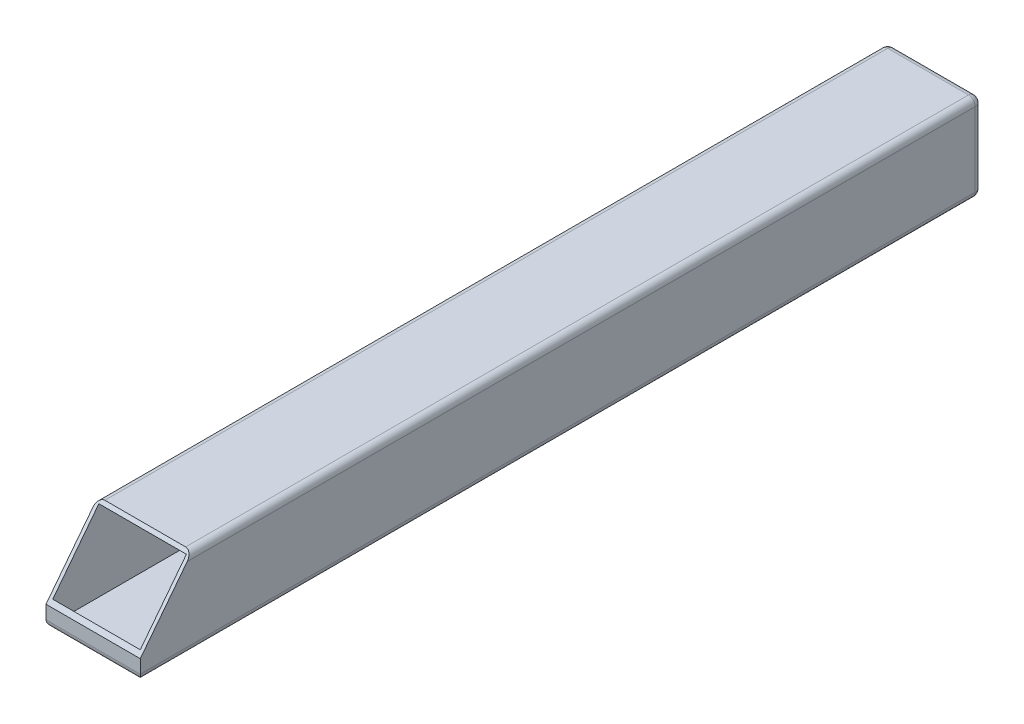
ISO-10303-21;
HEADER;
FILE_DESCRIPTION(('STEP AP214'),'2;1');
FILE_NAME('part.step','',(''),(''),'','','');
FILE_SCHEMA(('AUTOMOTIVE_DESIGN { 1 0 10303 214 1 1 1 1 }'));
ENDSEC;
DATA;
#1=APPLICATION_CONTEXT('core data for automotive mechanical design processes');
#2=APPLICATION_PROTOCOL_DEFINITION('international standard','automotive_design',2000,#1);
#3=PRODUCT_CONTEXT('',#1,'mechanical');
#4=PRODUCT('Part','Part','',(#3));
#5=PRODUCT_RELATED_PRODUCT_CATEGORY('part','',(#4));
#6=PRODUCT_DEFINITION_FORMATION('','',#4);
#7=PRODUCT_DEFINITION_CONTEXT('part definition',#1,'design');
#8=PRODUCT_DEFINITION('design','',#6,#7);
#9=PRODUCT_DEFINITION_SHAPE('','',#8);
#10=(LENGTH_UNIT() NAMED_UNIT(*) SI_UNIT(.MILLI.,.METRE.));
#11=(NAMED_UNIT(*) PLANE_ANGLE_UNIT() SI_UNIT($,.RADIAN.));
#12=(NAMED_UNIT(*) SI_UNIT($,.STERADIAN.) SOLID_ANGLE_UNIT());
#13=UNCERTAINTY_MEASURE_WITH_UNIT(LENGTH_MEASURE(1.E-05),#10,'distance_accuracy_value','');
#14=(GEOMETRIC_REPRESENTATION_CONTEXT(3) GLOBAL_UNCERTAINTY_ASSIGNED_CONTEXT((#13)) GLOBAL_UNIT_ASSIGNED_CONTEXT((#10,
#11,#12)) REPRESENTATION_CONTEXT('',''));
#15=CARTESIAN_POINT('',(0.,0.,0.));
#16=DIRECTION('',(0.,0.,1.));
#17=DIRECTION('',(1.,0.,0.));
#18=AXIS2_PLACEMENT_3D('',#15,#16,#17);
#19=CARTESIAN_POINT('',(-160.609485721589,165.1,-98.3178869980096));
#20=DIRECTION('',(0.,-0.612154920715207,-0.790737853554614));
#21=DIRECTION('',(0.,0.790737853554615,-0.612154920715207));
#22=AXIS2_PLACEMENT_3D('',#19,#20,#21);
#23=PLANE('',#22);
#24=DIRECTION('',(1.,0.,0.));
#25=VECTOR('',#24,1.);
#26=CARTESIAN_POINT('',(-160.609485721589,165.1,-98.3178869980096));
#27=LINE('',#26,#25);
#28=CARTESIAN_POINT('',(12.7,165.1,-98.3178869980096));
#29=VERTEX_POINT('',#28);
#30=CARTESIAN_POINT('',(165.1,165.1,-98.3178869980096));
#31=VERTEX_POINT('',#30);
#32=EDGE_CURVE('E222',#29,#31,#27,.T.);
#33=ORIENTED_EDGE('',*,*,#32,.F.);
#34=CARTESIAN_POINT('',(12.7,152.4,-88.4860982982086));
#35=DIRECTION('',(0.,-0.612154920715207,-0.790737853554614));
#36=DIRECTION('',(0.,-0.790737853554615,0.612154920715207));
#37=AXIS2_PLACEMENT_3D('',#34,#35,#36);
#38=ELLIPSE('',#37,16.0609485721589,12.7);
#39=CARTESIAN_POINT('',(0.,152.4,-88.4860982982087));
#40=VERTEX_POINT('',#39);
#41=EDGE_CURVE('E11',#29,#40,#38,.F.);
#42=ORIENTED_EDGE('',*,*,#41,.T.);
#43=DIRECTION('',(0.,-0.790737853554615,0.612154920715207));
#44=VECTOR('',#43,1.);
#45=CARTESIAN_POINT('',(0.,165.1,-98.3178869980096));
#46=LINE('',#45,#44);
#47=CARTESIAN_POINT('',(0.,38.1,0.));
#48=VERTEX_POINT('',#47);
#49=EDGE_CURVE('E226',#40,#48,#46,.T.);
#50=ORIENTED_EDGE('',*,*,#49,.T.);
#51=DIRECTION('',(1.,0.,0.));
#52=VECTOR('',#51,1.);
#53=CARTESIAN_POINT('',(-160.609485721589,38.1,0.));
#54=LINE('',#53,#52);
#55=CARTESIAN_POINT('',(177.8,38.1,0.));
#56=VERTEX_POINT('',#55);
#57=EDGE_CURVE('E221',#48,#56,#54,.T.);
#58=ORIENTED_EDGE('',*,*,#57,.T.);
#59=DIRECTION('',(0.,0.790737853554614,-0.612154920715207));
#60=VECTOR('',#59,1.);
#61=CARTESIAN_POINT('',(177.8,165.1,-98.3178869980096));
#62=LINE('',#61,#60);
#63=CARTESIAN_POINT('',(177.8,152.4,-88.4860982982087));
#64=VERTEX_POINT('',#63);
#65=EDGE_CURVE('E166',#56,#64,#62,.T.);
#66=ORIENTED_EDGE('',*,*,#65,.T.);
#67=CARTESIAN_POINT('',(165.1,152.4,-88.4860982982086));
#68=DIRECTION('',(0.,-0.612154920715207,-0.790737853554614));
#69=DIRECTION('',(0.,0.790737853554615,-0.612154920715207));
#70=AXIS2_PLACEMENT_3D('',#67,#68,#69);
#71=ELLIPSE('',#70,16.0609485721589,12.7);
#72=EDGE_CURVE('E49',#64,#31,#71,.F.);
#73=ORIENTED_EDGE('',*,*,#72,.T.);
#74=EDGE_LOOP('',(#33,#42,#50,#58,#66,#73));
#75=FACE_BOUND('',#74,.T.);
#76=DIRECTION('',(0.,-0.790737853554615,0.612154920715207));
#77=VECTOR('',#76,1.);
#78=CARTESIAN_POINT('',(6.34999999999999,165.1,-98.3178869980096));
#79=LINE('',#78,#77);
#80=CARTESIAN_POINT('',(6.35,158.75,-93.4019926481091));
#81=VERTEX_POINT('',#80);
#82=CARTESIAN_POINT('',(6.35,46.3024748967228,-6.35));
#83=VERTEX_POINT('',#82);
#84=EDGE_CURVE('E162',#81,#83,#79,.T.);
#85=ORIENTED_EDGE('',*,*,#84,.F.);
#86=DIRECTION('',(1.,0.,0.));
#87=VECTOR('',#86,1.);
#88=CARTESIAN_POINT('',(0.,158.75,-93.4019926481091));
#89=LINE('',#88,#87);
#90=CARTESIAN_POINT('',(171.45,158.75,-93.4019926481091));
#91=VERTEX_POINT('',#90);
#92=EDGE_CURVE('E185',#81,#91,#89,.T.);
#93=ORIENTED_EDGE('',*,*,#92,.T.);
#94=DIRECTION('',(0.,0.790737853554615,-0.612154920715207));
#95=VECTOR('',#94,1.);
#96=CARTESIAN_POINT('',(171.45,165.1,-98.3178869980096));
#97=LINE('',#96,#95);
#98=CARTESIAN_POINT('',(171.45,46.3024748967228,-6.35));
#99=VERTEX_POINT('',#98);
#100=EDGE_CURVE('E211',#99,#91,#97,.T.);
#101=ORIENTED_EDGE('',*,*,#100,.F.);
#102=DIRECTION('',(1.,0.,0.));
#103=VECTOR('',#102,1.);
#104=CARTESIAN_POINT('',(-160.609485721589,46.3024748967228,-6.34999999999999));
#105=LINE('',#104,#103);
#106=EDGE_CURVE('E208',#83,#99,#105,.T.);
#107=ORIENTED_EDGE('',*,*,#106,.F.);
#108=EDGE_LOOP('',(#85,#93,#101,#107));
#109=FACE_BOUND('',#108,.T.);
#110=ADVANCED_FACE('F39',(#75,#109),#23,.F.);
#111=CARTESIAN_POINT('',(0.,165.1,0.));
#112=DIRECTION('',(1.,0.,0.));
#113=DIRECTION('',(0.,0.,-1.));
#114=AXIS2_PLACEMENT_3D('',#111,#112,#113);
#115=PLANE('',#114);
#116=DIRECTION('',(0.,-1.,0.));
#117=VECTOR('',#116,1.);
#118=CARTESIAN_POINT('',(0.,165.1,-1574.8));
#119=LINE('',#118,#117);
#120=CARTESIAN_POINT('',(0.,152.4,-1574.8));
#121=VERTEX_POINT('',#120);
#122=CARTESIAN_POINT('',(0.,12.7,-1574.8));
#123=VERTEX_POINT('',#122);
#124=EDGE_CURVE('E57',#121,#123,#119,.T.);
#125=ORIENTED_EDGE('',*,*,#124,.T.);
#126=DIRECTION('',(0.,0.,1.));
#127=VECTOR('',#126,1.);
#128=CARTESIAN_POINT('',(0.,12.7,0.));
#129=LINE('',#128,#127);
#130=CARTESIAN_POINT('',(0.,12.7,0.));
#131=VERTEX_POINT('',#130);
#132=EDGE_CURVE('E288',#123,#131,#129,.T.);
#133=ORIENTED_EDGE('',*,*,#132,.T.);
#134=DIRECTION('',(0.,-1.,0.));
#135=VECTOR('',#134,1.);
#136=CARTESIAN_POINT('',(0.,165.1,0.));
#137=LINE('',#136,#135);
#138=EDGE_CURVE('E235',#48,#131,#137,.T.);
#139=ORIENTED_EDGE('',*,*,#138,.F.);
#140=ORIENTED_EDGE('',*,*,#49,.F.);
#141=DIRECTION('',(0.,0.,1.));
#142=VECTOR('',#141,1.);
#143=CARTESIAN_POINT('',(0.,152.4,0.));
#144=LINE('',#143,#142);
#145=EDGE_CURVE('E62',#40,#121,#144,.F.);
#146=ORIENTED_EDGE('',*,*,#145,.T.);
#147=EDGE_LOOP('',(#125,#133,#139,#140,#146));
#148=FACE_BOUND('',#147,.T.);
#149=ADVANCED_FACE('F417',(#148),#115,.F.);
#150=CARTESIAN_POINT('',(0.,165.1,0.));
#151=DIRECTION('',(0.,0.,-1.));
#152=DIRECTION('',(-1.,0.,0.));
#153=AXIS2_PLACEMENT_3D('',#150,#151,#152);
#154=PLANE('',#153);
#155=ORIENTED_EDGE('',*,*,#138,.T.);
#156=DIRECTION('',(1.,0.,0.));
#157=VECTOR('',#156,1.);
#158=CARTESIAN_POINT('',(177.8,12.7,0.));
#159=LINE('',#158,#157);
#160=CARTESIAN_POINT('',(177.8,12.7,0.));
#161=VERTEX_POINT('',#160);
#162=EDGE_CURVE('E291',#131,#161,#159,.T.);
#163=ORIENTED_EDGE('',*,*,#162,.T.);
#164=DIRECTION('',(0.,-1.,0.));
#165=VECTOR('',#164,1.);
#166=CARTESIAN_POINT('',(177.8,165.1,0.));
#167=LINE('',#166,#165);
#168=EDGE_CURVE('E231',#56,#161,#167,.T.);
#169=ORIENTED_EDGE('',*,*,#168,.F.);
#170=ORIENTED_EDGE('',*,*,#57,.F.);
#171=EDGE_LOOP('',(#155,#163,#169,#170));
#172=FACE_BOUND('',#171,.T.);
#173=ADVANCED_FACE('F384',(#172),#154,.F.);
#174=CARTESIAN_POINT('',(177.8,165.1,0.));
#175=DIRECTION('',(-1.,0.,0.));
#176=DIRECTION('',(0.,0.,1.));
#177=AXIS2_PLACEMENT_3D('',#174,#175,#176);
#178=PLANE('',#177);
#179=ORIENTED_EDGE('',*,*,#168,.T.);
#180=DIRECTION('',(0.,0.,-1.));
#181=VECTOR('',#180,1.);
#182=CARTESIAN_POINT('',(177.8,12.7,-1587.5));
#183=LINE('',#182,#181);
#184=CARTESIAN_POINT('',(177.8,12.7,-1574.8));
#185=VERTEX_POINT('',#184);
#186=EDGE_CURVE('E281',#161,#185,#183,.T.);
#187=ORIENTED_EDGE('',*,*,#186,.T.);
#188=DIRECTION('',(0.,-1.,0.));
#189=VECTOR('',#188,1.);
#190=CARTESIAN_POINT('',(177.8,165.1,-1574.8));
#191=LINE('',#190,#189);
#192=CARTESIAN_POINT('',(177.8,152.4,-1574.8));
#193=VERTEX_POINT('',#192);
#194=EDGE_CURVE('E278',#185,#193,#191,.F.);
#195=ORIENTED_EDGE('',*,*,#194,.T.);
#196=DIRECTION('',(0.,0.,-1.));
#197=VECTOR('',#196,1.);
#198=CARTESIAN_POINT('',(177.8,152.4,0.));
#199=LINE('',#198,#197);
#200=EDGE_CURVE('E275',#193,#64,#199,.F.);
#201=ORIENTED_EDGE('',*,*,#200,.T.);
#202=ORIENTED_EDGE('',*,*,#65,.F.);
#203=EDGE_LOOP('',(#179,#187,#195,#201,#202));
#204=FACE_BOUND('',#203,.T.);
#205=ADVANCED_FACE('F381',(#204),#178,.F.);
#206=CARTESIAN_POINT('',(0.,165.1,-1587.5));
#207=DIRECTION('',(0.,0.,1.));
#208=DIRECTION('',(1.,0.,0.));
#209=AXIS2_PLACEMENT_3D('',#206,#207,#208);
#210=PLANE('',#209);
#211=DIRECTION('',(-1.,0.,0.));
#212=VECTOR('',#211,1.);
#213=CARTESIAN_POINT('',(0.,152.4,-1587.5));
#214=LINE('',#213,#212);
#215=CARTESIAN_POINT('',(12.7,152.4,-1587.5));
#216=VERTEX_POINT('',#215);
#217=CARTESIAN_POINT('',(165.1,152.4,-1587.5));
#218=VERTEX_POINT('',#217);
#219=EDGE_CURVE('E242',#216,#218,#214,.F.);
#220=ORIENTED_EDGE('',*,*,#219,.T.);
#221=DIRECTION('',(0.,-1.,0.));
#222=VECTOR('',#221,1.);
#223=CARTESIAN_POINT('',(165.1,165.1,-1587.5));
#224=LINE('',#223,#222);
#225=CARTESIAN_POINT('',(165.1,12.7,-1587.5));
#226=VERTEX_POINT('',#225);
#227=EDGE_CURVE('E249',#218,#226,#224,.T.);
#228=ORIENTED_EDGE('',*,*,#227,.T.);
#229=DIRECTION('',(-1.,0.,0.));
#230=VECTOR('',#229,1.);
#231=CARTESIAN_POINT('',(0.,12.7,-1587.5));
#232=LINE('',#231,#230);
#233=CARTESIAN_POINT('',(12.7,12.7,-1587.5));
#234=VERTEX_POINT('',#233);
#235=EDGE_CURVE('E245',#226,#234,#232,.T.);
#236=ORIENTED_EDGE('',*,*,#235,.T.);
#237=DIRECTION('',(0.,-1.,0.));
#238=VECTOR('',#237,1.);
#239=CARTESIAN_POINT('',(12.7,165.1,-1587.5));
#240=LINE('',#239,#238);
#241=EDGE_CURVE('E239',#234,#216,#240,.F.);
#242=ORIENTED_EDGE('',*,*,#241,.T.);
#243=EDGE_LOOP('',(#220,#228,#236,#242));
#244=FACE_BOUND('',#243,.T.);
#245=ADVANCED_FACE('F361',(#244),#210,.F.);
#246=CARTESIAN_POINT('',(0.,165.1,0.));
#247=DIRECTION('',(0.,-1.,0.));
#248=DIRECTION('',(0.,0.,-1.));
#249=AXIS2_PLACEMENT_3D('',#246,#247,#248);
#250=PLANE('',#249);
#251=DIRECTION('',(-1.,0.,0.));
#252=VECTOR('',#251,1.);
#253=CARTESIAN_POINT('',(0.,165.1,-1574.8));
#254=LINE('',#253,#252);
#255=CARTESIAN_POINT('',(165.1,165.1,-1574.8));
#256=VERTEX_POINT('',#255);
#257=CARTESIAN_POINT('',(12.7,165.1,-1574.8));
#258=VERTEX_POINT('',#257);
#259=EDGE_CURVE('E268',#256,#258,#254,.T.);
#260=ORIENTED_EDGE('',*,*,#259,.T.);
#261=DIRECTION('',(0.,0.,1.));
#262=VECTOR('',#261,1.);
#263=CARTESIAN_POINT('',(12.7,165.1,0.));
#264=LINE('',#263,#262);
#265=EDGE_CURVE('E272',#258,#29,#264,.T.);
#266=ORIENTED_EDGE('',*,*,#265,.T.);
#267=ORIENTED_EDGE('',*,*,#32,.T.);
#268=DIRECTION('',(0.,0.,-1.));
#269=VECTOR('',#268,1.);
#270=CARTESIAN_POINT('',(165.1,165.1,0.));
#271=LINE('',#270,#269);
#272=EDGE_CURVE('E265',#31,#256,#271,.T.);
#273=ORIENTED_EDGE('',*,*,#272,.T.);
#274=EDGE_LOOP('',(#260,#266,#267,#273));
#275=FACE_BOUND('',#274,.T.);
#276=ADVANCED_FACE('F371',(#275),#250,.F.);
#277=CARTESIAN_POINT('',(0.,0.,0.));
#278=DIRECTION('',(0.,-1.,0.));
#279=DIRECTION('',(0.,0.,-1.));
#280=AXIS2_PLACEMENT_3D('',#277,#278,#279);
#281=PLANE('',#280);
#282=DIRECTION('',(0.,0.,1.));
#283=VECTOR('',#282,1.);
#284=CARTESIAN_POINT('',(12.7,0.,-1587.5));
#285=LINE('',#284,#283);
#286=CARTESIAN_POINT('',(12.7,0.,-12.7));
#287=VERTEX_POINT('',#286);
#288=CARTESIAN_POINT('',(12.7,0.,-1574.8));
#289=VERTEX_POINT('',#288);
#290=EDGE_CURVE('E258',#287,#289,#285,.F.);
#291=ORIENTED_EDGE('',*,*,#290,.T.);
#292=DIRECTION('',(-1.,0.,0.));
#293=VECTOR('',#292,1.);
#294=CARTESIAN_POINT('',(177.8,0.,-1574.8));
#295=LINE('',#294,#293);
#296=CARTESIAN_POINT('',(165.1,0.,-1574.8));
#297=VERTEX_POINT('',#296);
#298=EDGE_CURVE('E261',#289,#297,#295,.F.);
#299=ORIENTED_EDGE('',*,*,#298,.T.);
#300=DIRECTION('',(0.,0.,-1.));
#301=VECTOR('',#300,1.);
#302=CARTESIAN_POINT('',(165.1,0.,0.));
#303=LINE('',#302,#301);
#304=CARTESIAN_POINT('',(165.1,0.,-12.7));
#305=VERTEX_POINT('',#304);
#306=EDGE_CURVE('E255',#297,#305,#303,.F.);
#307=ORIENTED_EDGE('',*,*,#306,.T.);
#308=DIRECTION('',(1.,0.,0.));
#309=VECTOR('',#308,1.);
#310=CARTESIAN_POINT('',(0.,0.,-12.7));
#311=LINE('',#310,#309);
#312=EDGE_CURVE('E252',#305,#287,#311,.F.);
#313=ORIENTED_EDGE('',*,*,#312,.T.);
#314=EDGE_LOOP('',(#291,#299,#307,#313));
#315=FACE_BOUND('',#314,.T.);
#316=ADVANCED_FACE('F399',(#315),#281,.T.);
#317=CARTESIAN_POINT('',(6.35,165.1,0.));
#318=DIRECTION('',(1.,0.,0.));
#319=DIRECTION('',(0.,0.,-1.));
#320=AXIS2_PLACEMENT_3D('',#317,#318,#319);
#321=PLANE('',#320);
#322=DIRECTION('',(0.,-1.,0.));
#323=VECTOR('',#322,1.);
#324=CARTESIAN_POINT('',(6.35,165.1,-6.35));
#325=LINE('',#324,#323);
#326=CARTESIAN_POINT('',(6.35,6.35,-6.35));
#327=VERTEX_POINT('',#326);
#328=EDGE_CURVE('E154',#83,#327,#325,.T.);
#329=ORIENTED_EDGE('',*,*,#328,.T.);
#330=DIRECTION('',(0.,0.,1.));
#331=VECTOR('',#330,1.);
#332=CARTESIAN_POINT('',(6.35,6.35,0.));
#333=LINE('',#332,#331);
#334=CARTESIAN_POINT('',(6.35,6.35,-1581.15));
#335=VERTEX_POINT('',#334);
#336=EDGE_CURVE('E159',#335,#327,#333,.T.);
#337=ORIENTED_EDGE('',*,*,#336,.F.);
#338=DIRECTION('',(0.,-1.,0.));
#339=VECTOR('',#338,1.);
#340=CARTESIAN_POINT('',(6.35,165.1,-1581.15));
#341=LINE('',#340,#339);
#342=CARTESIAN_POINT('',(6.35,158.75,-1581.15));
#343=VERTEX_POINT('',#342);
#344=EDGE_CURVE('E189',#343,#335,#341,.T.);
#345=ORIENTED_EDGE('',*,*,#344,.F.);
#346=DIRECTION('',(0.,0.,1.));
#347=VECTOR('',#346,1.);
#348=CARTESIAN_POINT('',(6.35,158.75,0.));
#349=LINE('',#348,#347);
#350=EDGE_CURVE('E198',#343,#81,#349,.T.);
#351=ORIENTED_EDGE('',*,*,#350,.T.);
#352=ORIENTED_EDGE('',*,*,#84,.T.);
#353=EDGE_LOOP('',(#329,#337,#345,#351,#352));
#354=FACE_BOUND('',#353,.T.);
#355=ADVANCED_FACE('F156',(#354),#321,.T.);
#356=CARTESIAN_POINT('',(0.,165.1,-6.35));
#357=DIRECTION('',(0.,0.,-1.));
#358=DIRECTION('',(-1.,0.,0.));
#359=AXIS2_PLACEMENT_3D('',#356,#357,#358);
#360=PLANE('',#359);
#361=DIRECTION('',(0.,-1.,0.));
#362=VECTOR('',#361,1.);
#363=CARTESIAN_POINT('',(171.45,165.1,-6.35));
#364=LINE('',#363,#362);
#365=CARTESIAN_POINT('',(171.45,6.35,-6.35));
#366=VERTEX_POINT('',#365);
#367=EDGE_CURVE('E167',#99,#366,#364,.T.);
#368=ORIENTED_EDGE('',*,*,#367,.T.);
#369=DIRECTION('',(1.,0.,0.));
#370=VECTOR('',#369,1.);
#371=CARTESIAN_POINT('',(0.,6.35,-6.35));
#372=LINE('',#371,#370);
#373=EDGE_CURVE('E170',#327,#366,#372,.T.);
#374=ORIENTED_EDGE('',*,*,#373,.F.);
#375=ORIENTED_EDGE('',*,*,#328,.F.);
#376=ORIENTED_EDGE('',*,*,#106,.T.);
#377=EDGE_LOOP('',(#368,#374,#375,#376));
#378=FACE_BOUND('',#377,.T.);
#379=ADVANCED_FACE('F171',(#378),#360,.T.);
#380=CARTESIAN_POINT('',(171.45,165.1,0.));
#381=DIRECTION('',(-1.,0.,0.));
#382=DIRECTION('',(0.,0.,1.));
#383=AXIS2_PLACEMENT_3D('',#380,#381,#382);
#384=PLANE('',#383);
#385=DIRECTION('',(0.,0.,-1.));
#386=VECTOR('',#385,1.);
#387=CARTESIAN_POINT('',(171.45,158.75,0.));
#388=LINE('',#387,#386);
#389=CARTESIAN_POINT('',(171.45,158.75,-1581.15));
#390=VERTEX_POINT('',#389);
#391=EDGE_CURVE('E194',#91,#390,#388,.T.);
#392=ORIENTED_EDGE('',*,*,#391,.T.);
#393=DIRECTION('',(0.,-1.,0.));
#394=VECTOR('',#393,1.);
#395=CARTESIAN_POINT('',(171.45,165.1,-1581.15));
#396=LINE('',#395,#394);
#397=CARTESIAN_POINT('',(171.45,6.35,-1581.15));
#398=VERTEX_POINT('',#397);
#399=EDGE_CURVE('E192',#390,#398,#396,.T.);
#400=ORIENTED_EDGE('',*,*,#399,.T.);
#401=DIRECTION('',(0.,0.,-1.));
#402=VECTOR('',#401,1.);
#403=CARTESIAN_POINT('',(171.45,6.35,0.));
#404=LINE('',#403,#402);
#405=EDGE_CURVE('E176',#366,#398,#404,.T.);
#406=ORIENTED_EDGE('',*,*,#405,.F.);
#407=ORIENTED_EDGE('',*,*,#367,.F.);
#408=ORIENTED_EDGE('',*,*,#100,.T.);
#409=EDGE_LOOP('',(#392,#400,#406,#407,#408));
#410=FACE_BOUND('',#409,.T.);
#411=ADVANCED_FACE('F500',(#410),#384,.T.);
#412=CARTESIAN_POINT('',(0.,165.1,-1581.15));
#413=DIRECTION('',(0.,0.,1.));
#414=DIRECTION('',(1.,0.,0.));
#415=AXIS2_PLACEMENT_3D('',#412,#413,#414);
#416=PLANE('',#415);
#417=DIRECTION('',(-1.,0.,0.));
#418=VECTOR('',#417,1.);
#419=CARTESIAN_POINT('',(0.,6.35,-1581.15));
#420=LINE('',#419,#418);
#421=EDGE_CURVE('E180',#398,#335,#420,.T.);
#422=ORIENTED_EDGE('',*,*,#421,.F.);
#423=ORIENTED_EDGE('',*,*,#399,.F.);
#424=DIRECTION('',(-1.,0.,0.));
#425=VECTOR('',#424,1.);
#426=CARTESIAN_POINT('',(0.,158.75,-1581.15));
#427=LINE('',#426,#425);
#428=EDGE_CURVE('E197',#390,#343,#427,.T.);
#429=ORIENTED_EDGE('',*,*,#428,.T.);
#430=ORIENTED_EDGE('',*,*,#344,.T.);
#431=EDGE_LOOP('',(#422,#423,#429,#430));
#432=FACE_BOUND('',#431,.T.);
#433=ADVANCED_FACE('F461',(#432),#416,.T.);
#434=CARTESIAN_POINT('',(0.,158.75,0.));
#435=DIRECTION('',(0.,-1.,0.));
#436=DIRECTION('',(0.,0.,-1.));
#437=AXIS2_PLACEMENT_3D('',#434,#435,#436);
#438=PLANE('',#437);
#439=ORIENTED_EDGE('',*,*,#350,.F.);
#440=ORIENTED_EDGE('',*,*,#428,.F.);
#441=ORIENTED_EDGE('',*,*,#391,.F.);
#442=ORIENTED_EDGE('',*,*,#92,.F.);
#443=EDGE_LOOP('',(#439,#440,#441,#442));
#444=FACE_BOUND('',#443,.T.);
#445=ADVANCED_FACE('F456',(#444),#438,.T.);
#446=CARTESIAN_POINT('',(0.,6.35,0.));
#447=DIRECTION('',(0.,-1.,0.));
#448=DIRECTION('',(0.,0.,-1.));
#449=AXIS2_PLACEMENT_3D('',#446,#447,#448);
#450=PLANE('',#449);
#451=ORIENTED_EDGE('',*,*,#336,.T.);
#452=ORIENTED_EDGE('',*,*,#373,.T.);
#453=ORIENTED_EDGE('',*,*,#405,.T.);
#454=ORIENTED_EDGE('',*,*,#421,.T.);
#455=EDGE_LOOP('',(#451,#452,#453,#454));
#456=FACE_BOUND('',#455,.T.);
#457=ADVANCED_FACE('F178',(#456),#450,.F.);
#458=CARTESIAN_POINT('',(165.1,152.4,0.));
#459=DIRECTION('',(0.,0.,-1.));
#460=DIRECTION('',(-1.,0.,0.));
#461=AXIS2_PLACEMENT_3D('',#458,#459,#460);
#462=CYLINDRICAL_SURFACE('',#461,12.7);
#463=ORIENTED_EDGE('',*,*,#72,.F.);
#464=ORIENTED_EDGE('',*,*,#200,.F.);
#465=CARTESIAN_POINT('',(165.1,152.4,-1574.8));
#466=DIRECTION('',(0.,0.,-1.));
#467=DIRECTION('',(-1.,0.,0.));
#468=AXIS2_PLACEMENT_3D('',#465,#466,#467);
#469=CIRCLE('',#468,12.7);
#470=EDGE_CURVE('E43',#256,#193,#469,.T.);
#471=ORIENTED_EDGE('',*,*,#470,.F.);
#472=ORIENTED_EDGE('',*,*,#272,.F.);
#473=EDGE_LOOP('',(#463,#464,#471,#472));
#474=FACE_BOUND('',#473,.T.);
#475=ADVANCED_FACE('F41',(#474),#462,.T.);
#476=CARTESIAN_POINT('',(0.,152.4,-1574.8));
#477=DIRECTION('',(-1.,0.,0.));
#478=DIRECTION('',(0.,0.,1.));
#479=AXIS2_PLACEMENT_3D('',#476,#477,#478);
#480=CYLINDRICAL_SURFACE('',#479,12.7);
#481=CARTESIAN_POINT('',(12.7,152.4,-1574.8));
#482=DIRECTION('',(-1.,0.,0.));
#483=DIRECTION('',(0.,0.,1.));
#484=AXIS2_PLACEMENT_3D('',#481,#482,#483);
#485=CIRCLE('',#484,12.7);
#486=EDGE_CURVE('E337',#258,#216,#485,.T.);
#487=ORIENTED_EDGE('',*,*,#486,.F.);
#488=ORIENTED_EDGE('',*,*,#259,.F.);
#489=CARTESIAN_POINT('',(165.1,152.4,-1574.8));
#490=DIRECTION('',(1.,0.,0.));
#491=DIRECTION('',(0.,0.,-1.));
#492=AXIS2_PLACEMENT_3D('',#489,#490,#491);
#493=CIRCLE('',#492,12.7);
#494=EDGE_CURVE('E340',#218,#256,#493,.T.);
#495=ORIENTED_EDGE('',*,*,#494,.F.);
#496=ORIENTED_EDGE('',*,*,#219,.F.);
#497=EDGE_LOOP('',(#487,#488,#495,#496));
#498=FACE_BOUND('',#497,.T.);
#499=ADVANCED_FACE('F368',(#498),#480,.T.);
#500=CARTESIAN_POINT('',(12.7,152.4,0.));
#501=DIRECTION('',(0.,0.,1.));
#502=DIRECTION('',(1.,0.,0.));
#503=AXIS2_PLACEMENT_3D('',#500,#501,#502);
#504=CYLINDRICAL_SURFACE('',#503,12.7);
#505=ORIENTED_EDGE('',*,*,#41,.F.);
#506=ORIENTED_EDGE('',*,*,#265,.F.);
#507=CARTESIAN_POINT('',(12.7,152.4,-1574.8));
#508=DIRECTION('',(0.,0.,-1.));
#509=DIRECTION('',(-1.,0.,0.));
#510=AXIS2_PLACEMENT_3D('',#507,#508,#509);
#511=CIRCLE('',#510,12.7);
#512=EDGE_CURVE('E334',#121,#258,#511,.T.);
#513=ORIENTED_EDGE('',*,*,#512,.F.);
#514=ORIENTED_EDGE('',*,*,#145,.F.);
#515=EDGE_LOOP('',(#505,#506,#513,#514));
#516=FACE_BOUND('',#515,.T.);
#517=ADVANCED_FACE('F416',(#516),#504,.T.);
#518=CARTESIAN_POINT('',(165.1,152.4,-1574.8));
#519=DIRECTION('',(0.,0.,1.));
#520=DIRECTION('',(1.,0.,0.));
#521=AXIS2_PLACEMENT_3D('',#518,#519,#520);
#522=SPHERICAL_SURFACE('',#521,12.7);
#523=ORIENTED_EDGE('',*,*,#494,.T.);
#524=ORIENTED_EDGE('',*,*,#470,.T.);
#525=CARTESIAN_POINT('',(165.1,152.4,-1574.8));
#526=DIRECTION('',(0.,1.,0.));
#527=DIRECTION('',(0.,0.,1.));
#528=AXIS2_PLACEMENT_3D('',#525,#526,#527);
#529=CIRCLE('',#528,12.7);
#530=EDGE_CURVE('E326',#218,#193,#529,.F.);
#531=ORIENTED_EDGE('',*,*,#530,.F.);
#532=EDGE_LOOP('',(#523,#524,#531));
#533=FACE_BOUND('',#532,.T.);
#534=ADVANCED_FACE('F349',(#533),#522,.T.);
#535=CARTESIAN_POINT('',(12.7,152.4,-1574.8));
#536=DIRECTION('',(0.,0.,1.));
#537=DIRECTION('',(1.,0.,0.));
#538=AXIS2_PLACEMENT_3D('',#535,#536,#537);
#539=SPHERICAL_SURFACE('',#538,12.7);
#540=ORIENTED_EDGE('',*,*,#512,.T.);
#541=ORIENTED_EDGE('',*,*,#486,.T.);
#542=CARTESIAN_POINT('',(12.7,152.4,-1574.8));
#543=DIRECTION('',(0.,1.,0.));
#544=DIRECTION('',(0.,0.,1.));
#545=AXIS2_PLACEMENT_3D('',#542,#543,#544);
#546=CIRCLE('',#545,12.7);
#547=EDGE_CURVE('E322',#121,#216,#546,.F.);
#548=ORIENTED_EDGE('',*,*,#547,.F.);
#549=EDGE_LOOP('',(#540,#541,#548));
#550=FACE_BOUND('',#549,.T.);
#551=ADVANCED_FACE('F414',(#550),#539,.T.);
#552=CARTESIAN_POINT('',(0.,12.7,-12.7));
#553=DIRECTION('',(-1.,0.,0.));
#554=DIRECTION('',(0.,0.,1.));
#555=AXIS2_PLACEMENT_3D('',#552,#553,#554);
#556=CYLINDRICAL_SURFACE('',#555,12.7);
#557=CARTESIAN_POINT('',(12.7,12.7,-12.7));
#558=DIRECTION('',(-0.707106781186547,0.,-0.707106781186547));
#559=DIRECTION('',(-0.707106781186547,0.,0.707106781186547));
#560=AXIS2_PLACEMENT_3D('',#557,#558,#559);
#561=ELLIPSE('',#560,17.9605122421383,12.7);
#562=EDGE_CURVE('E318',#287,#131,#561,.T.);
#563=ORIENTED_EDGE('',*,*,#562,.F.);
#564=ORIENTED_EDGE('',*,*,#312,.F.);
#565=CARTESIAN_POINT('',(165.1,12.7,-12.7));
#566=DIRECTION('',(-0.707106781186547,0.,0.707106781186547));
#567=DIRECTION('',(-0.707106781186547,0.,-0.707106781186547));
#568=AXIS2_PLACEMENT_3D('',#565,#566,#567);
#569=ELLIPSE('',#568,17.9605122421383,12.7);
#570=EDGE_CURVE('E330',#161,#305,#569,.F.);
#571=ORIENTED_EDGE('',*,*,#570,.F.);
#572=ORIENTED_EDGE('',*,*,#162,.F.);
#573=EDGE_LOOP('',(#563,#564,#571,#572));
#574=FACE_BOUND('',#573,.T.);
#575=ADVANCED_FACE('F389',(#574),#556,.T.);
#576=CARTESIAN_POINT('',(165.1,12.7,0.));
#577=DIRECTION('',(0.,0.,1.));
#578=DIRECTION('',(1.,0.,0.));
#579=AXIS2_PLACEMENT_3D('',#576,#577,#578);
#580=CYLINDRICAL_SURFACE('',#579,12.7);
#581=ORIENTED_EDGE('',*,*,#570,.T.);
#582=ORIENTED_EDGE('',*,*,#306,.F.);
#583=CARTESIAN_POINT('',(165.1,12.7,-1574.8));
#584=DIRECTION('',(0.,0.,-1.));
#585=DIRECTION('',(-1.,0.,0.));
#586=AXIS2_PLACEMENT_3D('',#583,#584,#585);
#587=CIRCLE('',#586,12.7);
#588=EDGE_CURVE('E314',#185,#297,#587,.T.);
#589=ORIENTED_EDGE('',*,*,#588,.F.);
#590=ORIENTED_EDGE('',*,*,#186,.F.);
#591=EDGE_LOOP('',(#581,#582,#589,#590));
#592=FACE_BOUND('',#591,.T.);
#593=ADVANCED_FACE('F402',(#592),#580,.T.);
#594=CARTESIAN_POINT('',(165.1,165.1,-1574.8));
#595=DIRECTION('',(0.,-1.,0.));
#596=DIRECTION('',(0.,0.,-1.));
#597=AXIS2_PLACEMENT_3D('',#594,#595,#596);
#598=CYLINDRICAL_SURFACE('',#597,12.7);
#599=ORIENTED_EDGE('',*,*,#530,.T.);
#600=ORIENTED_EDGE('',*,*,#194,.F.);
#601=CARTESIAN_POINT('',(165.1,12.7,-1574.8));
#602=DIRECTION('',(0.,-1.,0.));
#603=DIRECTION('',(0.,0.,-1.));
#604=AXIS2_PLACEMENT_3D('',#601,#602,#603);
#605=CIRCLE('',#604,12.7);
#606=EDGE_CURVE('E310',#226,#185,#605,.T.);
#607=ORIENTED_EDGE('',*,*,#606,.F.);
#608=ORIENTED_EDGE('',*,*,#227,.F.);
#609=EDGE_LOOP('',(#599,#600,#607,#608));
#610=FACE_BOUND('',#609,.T.);
#611=ADVANCED_FACE('F356',(#610),#598,.T.);
#612=CARTESIAN_POINT('',(12.7,165.1,-1574.8));
#613=DIRECTION('',(0.,-1.,0.));
#614=DIRECTION('',(0.,0.,-1.));
#615=AXIS2_PLACEMENT_3D('',#612,#613,#614);
#616=CYLINDRICAL_SURFACE('',#615,12.7);
#617=ORIENTED_EDGE('',*,*,#547,.T.);
#618=ORIENTED_EDGE('',*,*,#241,.F.);
#619=CARTESIAN_POINT('',(12.7,12.7,-1574.8));
#620=DIRECTION('',(0.,-1.,0.));
#621=DIRECTION('',(0.,0.,-1.));
#622=AXIS2_PLACEMENT_3D('',#619,#620,#621);
#623=CIRCLE('',#622,12.7);
#624=EDGE_CURVE('E306',#123,#234,#623,.T.);
#625=ORIENTED_EDGE('',*,*,#624,.F.);
#626=ORIENTED_EDGE('',*,*,#124,.F.);
#627=EDGE_LOOP('',(#617,#618,#625,#626));
#628=FACE_BOUND('',#627,.T.);
#629=ADVANCED_FACE('F411',(#628),#616,.T.);
#630=CARTESIAN_POINT('',(12.7,12.7,0.));
#631=DIRECTION('',(0.,0.,-1.));
#632=DIRECTION('',(-1.,0.,0.));
#633=AXIS2_PLACEMENT_3D('',#630,#631,#632);
#634=CYLINDRICAL_SURFACE('',#633,12.7);
#635=ORIENTED_EDGE('',*,*,#562,.T.);
#636=ORIENTED_EDGE('',*,*,#132,.F.);
#637=CARTESIAN_POINT('',(12.7,12.7,-1574.8));
#638=DIRECTION('',(0.,0.,-1.));
#639=DIRECTION('',(-1.,0.,0.));
#640=AXIS2_PLACEMENT_3D('',#637,#638,#639);
#641=CIRCLE('',#640,12.7);
#642=EDGE_CURVE('E302',#289,#123,#641,.T.);
#643=ORIENTED_EDGE('',*,*,#642,.F.);
#644=ORIENTED_EDGE('',*,*,#290,.F.);
#645=EDGE_LOOP('',(#635,#636,#643,#644));
#646=FACE_BOUND('',#645,.T.);
#647=ADVANCED_FACE('F394',(#646),#634,.T.);
#648=CARTESIAN_POINT('',(165.1,12.7,-1574.8));
#649=DIRECTION('',(0.,0.,1.));
#650=DIRECTION('',(1.,0.,0.));
#651=AXIS2_PLACEMENT_3D('',#648,#649,#650);
#652=SPHERICAL_SURFACE('',#651,12.7);
#653=ORIENTED_EDGE('',*,*,#606,.T.);
#654=ORIENTED_EDGE('',*,*,#588,.T.);
#655=CARTESIAN_POINT('',(165.1,12.7,-1574.8));
#656=DIRECTION('',(1.,0.,0.));
#657=DIRECTION('',(0.,0.,-1.));
#658=AXIS2_PLACEMENT_3D('',#655,#656,#657);
#659=CIRCLE('',#658,12.7);
#660=EDGE_CURVE('E299',#226,#297,#659,.F.);
#661=ORIENTED_EDGE('',*,*,#660,.F.);
#662=EDGE_LOOP('',(#653,#654,#661));
#663=FACE_BOUND('',#662,.T.);
#664=ADVANCED_FACE('F404',(#663),#652,.T.);
#665=CARTESIAN_POINT('',(12.7,12.7,-1574.8));
#666=DIRECTION('',(0.,0.,1.));
#667=DIRECTION('',(1.,0.,0.));
#668=AXIS2_PLACEMENT_3D('',#665,#666,#667);
#669=SPHERICAL_SURFACE('',#668,12.7);
#670=ORIENTED_EDGE('',*,*,#642,.T.);
#671=ORIENTED_EDGE('',*,*,#624,.T.);
#672=CARTESIAN_POINT('',(12.7,12.7,-1574.8));
#673=DIRECTION('',(-1.,0.,0.));
#674=DIRECTION('',(0.,0.,1.));
#675=AXIS2_PLACEMENT_3D('',#672,#673,#674);
#676=CIRCLE('',#675,12.7);
#677=EDGE_CURVE('E296',#289,#234,#676,.F.);
#678=ORIENTED_EDGE('',*,*,#677,.F.);
#679=EDGE_LOOP('',(#670,#671,#678));
#680=FACE_BOUND('',#679,.T.);
#681=ADVANCED_FACE('F409',(#680),#669,.T.);
#682=CARTESIAN_POINT('',(0.,12.7,-1574.8));
#683=DIRECTION('',(1.,0.,0.));
#684=DIRECTION('',(0.,0.,-1.));
#685=AXIS2_PLACEMENT_3D('',#682,#683,#684);
#686=CYLINDRICAL_SURFACE('',#685,12.7);
#687=ORIENTED_EDGE('',*,*,#660,.T.);
#688=ORIENTED_EDGE('',*,*,#298,.F.);
#689=ORIENTED_EDGE('',*,*,#677,.T.);
#690=ORIENTED_EDGE('',*,*,#235,.F.);
#691=EDGE_LOOP('',(#687,#688,#689,#690));
#692=FACE_BOUND('',#691,.T.);
#693=ADVANCED_FACE('F406',(#692),#686,.T.);
#694=CLOSED_SHELL('',(#110,#149,#173,#205,#245,#276,#316,#355,#379,#411,#433,#445,#457,#475,
#499,#517,#534,#551,#575,#593,#611,#629,#647,#664,#681,#693));
#695=MANIFOLD_SOLID_BREP('B2',#694);
#696=ADVANCED_BREP_SHAPE_REPRESENTATION('',(#18,#695),#14);
#697=SHAPE_DEFINITION_REPRESENTATION(#9,#696);
ENDSEC;
END-ISO-10303-21;
